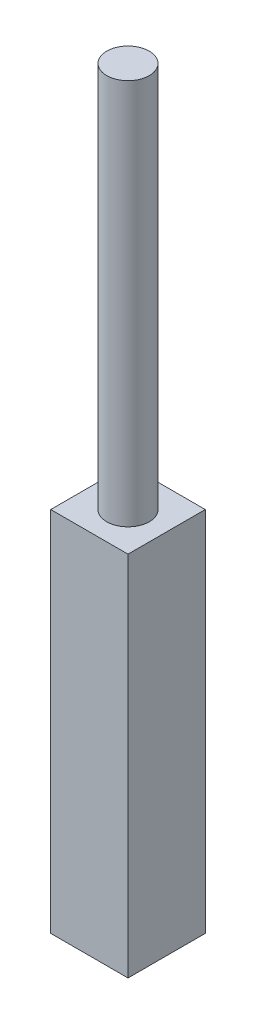
ISO-10303-21;
HEADER;
FILE_DESCRIPTION(('STEP AP214'),'2;1');
FILE_NAME('part.step','',(''),(''),'','','');
FILE_SCHEMA(('AUTOMOTIVE_DESIGN { 1 0 10303 214 1 1 1 1 }'));
ENDSEC;
DATA;
#1=APPLICATION_CONTEXT('core data for automotive mechanical design processes');
#2=APPLICATION_PROTOCOL_DEFINITION('international standard','automotive_design',2000,#1);
#3=PRODUCT_CONTEXT('',#1,'mechanical');
#4=PRODUCT('Part','Part','',(#3));
#5=PRODUCT_RELATED_PRODUCT_CATEGORY('part','',(#4));
#6=PRODUCT_DEFINITION_FORMATION('','',#4);
#7=PRODUCT_DEFINITION_CONTEXT('part definition',#1,'design');
#8=PRODUCT_DEFINITION('design','',#6,#7);
#9=PRODUCT_DEFINITION_SHAPE('','',#8);
#10=(LENGTH_UNIT() NAMED_UNIT(*) SI_UNIT(.MILLI.,.METRE.));
#11=(NAMED_UNIT(*) PLANE_ANGLE_UNIT() SI_UNIT($,.RADIAN.));
#12=(NAMED_UNIT(*) SI_UNIT($,.STERADIAN.) SOLID_ANGLE_UNIT());
#13=UNCERTAINTY_MEASURE_WITH_UNIT(LENGTH_MEASURE(1.E-05),#10,'distance_accuracy_value','');
#14=(GEOMETRIC_REPRESENTATION_CONTEXT(3) GLOBAL_UNCERTAINTY_ASSIGNED_CONTEXT((#13)) GLOBAL_UNIT_ASSIGNED_CONTEXT((#10,
#11,#12)) REPRESENTATION_CONTEXT('',''));
#15=CARTESIAN_POINT('',(0.,0.,0.));
#16=DIRECTION('',(0.,0.,1.));
#17=DIRECTION('',(1.,0.,0.));
#18=AXIS2_PLACEMENT_3D('',#15,#16,#17);
#19=CARTESIAN_POINT('',(1.27,12.065,1.27));
#20=DIRECTION('',(-1.,0.,0.));
#21=DIRECTION('',(0.,0.,1.));
#22=AXIS2_PLACEMENT_3D('',#19,#20,#21);
#23=PLANE('',#22);
#24=DIRECTION('',(0.,0.,-1.));
#25=VECTOR('',#24,1.);
#26=CARTESIAN_POINT('',(1.27,0.,1.27));
#27=LINE('',#26,#25);
#28=CARTESIAN_POINT('',(1.27,0.,1.27));
#29=VERTEX_POINT('',#28);
#30=CARTESIAN_POINT('',(1.27,0.,-1.27));
#31=VERTEX_POINT('',#30);
#32=EDGE_CURVE('E120',#29,#31,#27,.T.);
#33=ORIENTED_EDGE('',*,*,#32,.T.);
#34=DIRECTION('',(0.,-1.,0.));
#35=VECTOR('',#34,1.);
#36=CARTESIAN_POINT('',(1.27,12.065,-1.27));
#37=LINE('',#36,#35);
#38=CARTESIAN_POINT('',(1.27,12.065,-1.27));
#39=VERTEX_POINT('',#38);
#40=EDGE_CURVE('E52',#39,#31,#37,.T.);
#41=ORIENTED_EDGE('',*,*,#40,.F.);
#42=DIRECTION('',(0.,0.,-1.));
#43=VECTOR('',#42,1.);
#44=CARTESIAN_POINT('',(1.27,12.065,1.27));
#45=LINE('',#44,#43);
#46=CARTESIAN_POINT('',(1.27,12.065,1.27));
#47=VERTEX_POINT('',#46);
#48=EDGE_CURVE('E103',#47,#39,#45,.T.);
#49=ORIENTED_EDGE('',*,*,#48,.F.);
#50=DIRECTION('',(0.,-1.,0.));
#51=VECTOR('',#50,1.);
#52=CARTESIAN_POINT('',(1.27,12.065,1.27));
#53=LINE('',#52,#51);
#54=EDGE_CURVE('E116',#47,#29,#53,.T.);
#55=ORIENTED_EDGE('',*,*,#54,.T.);
#56=EDGE_LOOP('',(#33,#41,#49,#55));
#57=FACE_BOUND('',#56,.T.);
#58=ADVANCED_FACE('F49',(#57),#23,.F.);
#59=CARTESIAN_POINT('',(-1.27,12.065,-1.27));
#60=DIRECTION('',(0.,0.,1.));
#61=DIRECTION('',(1.,0.,0.));
#62=AXIS2_PLACEMENT_3D('',#59,#60,#61);
#63=PLANE('',#62);
#64=DIRECTION('',(-1.,0.,0.));
#65=VECTOR('',#64,1.);
#66=CARTESIAN_POINT('',(-1.27,0.,-1.27));
#67=LINE('',#66,#65);
#68=CARTESIAN_POINT('',(-1.27,0.,-1.27));
#69=VERTEX_POINT('',#68);
#70=EDGE_CURVE('E109',#31,#69,#67,.T.);
#71=ORIENTED_EDGE('',*,*,#70,.T.);
#72=DIRECTION('',(0.,-1.,0.));
#73=VECTOR('',#72,1.);
#74=CARTESIAN_POINT('',(-1.27,12.065,-1.27));
#75=LINE('',#74,#73);
#76=CARTESIAN_POINT('',(-1.27,12.065,-1.27));
#77=VERTEX_POINT('',#76);
#78=EDGE_CURVE('E107',#77,#69,#75,.T.);
#79=ORIENTED_EDGE('',*,*,#78,.F.);
#80=DIRECTION('',(-1.,0.,0.));
#81=VECTOR('',#80,1.);
#82=CARTESIAN_POINT('',(-1.27,12.065,-1.27));
#83=LINE('',#82,#81);
#84=EDGE_CURVE('E98',#39,#77,#83,.T.);
#85=ORIENTED_EDGE('',*,*,#84,.F.);
#86=ORIENTED_EDGE('',*,*,#40,.T.);
#87=EDGE_LOOP('',(#71,#79,#85,#86));
#88=FACE_BOUND('',#87,.T.);
#89=ADVANCED_FACE('F108',(#88),#63,.F.);
#90=CARTESIAN_POINT('',(-1.27,12.065,1.27));
#91=DIRECTION('',(1.,0.,0.));
#92=DIRECTION('',(0.,0.,-1.));
#93=AXIS2_PLACEMENT_3D('',#90,#91,#92);
#94=PLANE('',#93);
#95=DIRECTION('',(0.,0.,1.));
#96=VECTOR('',#95,1.);
#97=CARTESIAN_POINT('',(-1.27,0.,1.27));
#98=LINE('',#97,#96);
#99=CARTESIAN_POINT('',(-1.27,0.,1.27));
#100=VERTEX_POINT('',#99);
#101=EDGE_CURVE('E84',#69,#100,#98,.T.);
#102=ORIENTED_EDGE('',*,*,#101,.T.);
#103=DIRECTION('',(0.,-1.,0.));
#104=VECTOR('',#103,1.);
#105=CARTESIAN_POINT('',(-1.27,12.065,1.27));
#106=LINE('',#105,#104);
#107=CARTESIAN_POINT('',(-1.27,12.065,1.27));
#108=VERTEX_POINT('',#107);
#109=EDGE_CURVE('E111',#108,#100,#106,.T.);
#110=ORIENTED_EDGE('',*,*,#109,.F.);
#111=DIRECTION('',(0.,0.,1.));
#112=VECTOR('',#111,1.);
#113=CARTESIAN_POINT('',(-1.27,12.065,1.27));
#114=LINE('',#113,#112);
#115=EDGE_CURVE('E101',#77,#108,#114,.T.);
#116=ORIENTED_EDGE('',*,*,#115,.F.);
#117=ORIENTED_EDGE('',*,*,#78,.T.);
#118=EDGE_LOOP('',(#102,#110,#116,#117));
#119=FACE_BOUND('',#118,.T.);
#120=ADVANCED_FACE('F112',(#119),#94,.F.);
#121=CARTESIAN_POINT('',(-1.27,12.065,1.27));
#122=DIRECTION('',(0.,0.,-1.));
#123=DIRECTION('',(-1.,0.,0.));
#124=AXIS2_PLACEMENT_3D('',#121,#122,#123);
#125=PLANE('',#124);
#126=DIRECTION('',(1.,0.,0.));
#127=VECTOR('',#126,1.);
#128=CARTESIAN_POINT('',(-1.27,0.,1.27));
#129=LINE('',#128,#127);
#130=EDGE_CURVE('E90',#100,#29,#129,.T.);
#131=ORIENTED_EDGE('',*,*,#130,.T.);
#132=ORIENTED_EDGE('',*,*,#54,.F.);
#133=DIRECTION('',(1.,0.,0.));
#134=VECTOR('',#133,1.);
#135=CARTESIAN_POINT('',(-1.27,12.065,1.27));
#136=LINE('',#135,#134);
#137=EDGE_CURVE('E67',#108,#47,#136,.T.);
#138=ORIENTED_EDGE('',*,*,#137,.F.);
#139=ORIENTED_EDGE('',*,*,#109,.T.);
#140=EDGE_LOOP('',(#131,#132,#138,#139));
#141=FACE_BOUND('',#140,.T.);
#142=ADVANCED_FACE('F134',(#141),#125,.F.);
#143=CARTESIAN_POINT('',(0.,12.065,0.));
#144=DIRECTION('',(0.,-1.,0.));
#145=DIRECTION('',(0.,0.,-1.));
#146=AXIS2_PLACEMENT_3D('',#143,#144,#145);
#147=PLANE('',#146);
#148=CARTESIAN_POINT('',(0.,12.065,0.));
#149=DIRECTION('',(0.,1.,0.));
#150=DIRECTION('',(0.,0.,1.));
#151=AXIS2_PLACEMENT_3D('',#148,#149,#150);
#152=CIRCLE('',#151,0.6985);
#153=CARTESIAN_POINT('',(0.,12.065,0.6985));
#154=VERTEX_POINT('',#153);
#155=EDGE_CURVE('E11',#154,#154,#152,.T.);
#156=ORIENTED_EDGE('',*,*,#155,.F.);
#157=EDGE_LOOP('',(#156));
#158=FACE_BOUND('',#157,.T.);
#159=ORIENTED_EDGE('',*,*,#48,.T.);
#160=ORIENTED_EDGE('',*,*,#84,.T.);
#161=ORIENTED_EDGE('',*,*,#115,.T.);
#162=ORIENTED_EDGE('',*,*,#137,.T.);
#163=EDGE_LOOP('',(#159,#160,#161,#162));
#164=FACE_BOUND('',#163,.T.);
#165=ADVANCED_FACE('F99',(#158,#164),#147,.F.);
#166=CARTESIAN_POINT('',(0.,0.,0.));
#167=DIRECTION('',(0.,-1.,0.));
#168=DIRECTION('',(0.,0.,-1.));
#169=AXIS2_PLACEMENT_3D('',#166,#167,#168);
#170=PLANE('',#169);
#171=ORIENTED_EDGE('',*,*,#32,.F.);
#172=ORIENTED_EDGE('',*,*,#130,.F.);
#173=ORIENTED_EDGE('',*,*,#101,.F.);
#174=ORIENTED_EDGE('',*,*,#70,.F.);
#175=EDGE_LOOP('',(#171,#172,#173,#174));
#176=FACE_BOUND('',#175,.T.);
#177=ADVANCED_FACE('F137',(#176),#170,.T.);
#178=CARTESIAN_POINT('',(0.,24.765,0.));
#179=DIRECTION('',(0.,-1.,0.));
#180=DIRECTION('',(0.,0.,-1.));
#181=AXIS2_PLACEMENT_3D('',#178,#179,#180);
#182=CYLINDRICAL_SURFACE('',#181,0.6985);
#183=CARTESIAN_POINT('',(0.,24.765,0.));
#184=DIRECTION('',(0.,1.,0.));
#185=DIRECTION('',(0.,0.,1.));
#186=AXIS2_PLACEMENT_3D('',#183,#184,#185);
#187=CIRCLE('',#186,0.6985);
#188=CARTESIAN_POINT('',(0.,24.765,0.6985));
#189=VERTEX_POINT('',#188);
#190=EDGE_CURVE('E124',#189,#189,#187,.T.);
#191=ORIENTED_EDGE('',*,*,#190,.F.);
#192=EDGE_LOOP('',(#191));
#193=FACE_BOUND('',#192,.T.);
#194=ORIENTED_EDGE('',*,*,#155,.T.);
#195=EDGE_LOOP('',(#194));
#196=FACE_BOUND('',#195,.T.);
#197=ADVANCED_FACE('F147',(#193,#196),#182,.T.);
#198=CARTESIAN_POINT('',(0.,24.765,0.));
#199=DIRECTION('',(0.,1.,0.));
#200=DIRECTION('',(0.,0.,1.));
#201=AXIS2_PLACEMENT_3D('',#198,#199,#200);
#202=PLANE('',#201);
#203=ORIENTED_EDGE('',*,*,#190,.T.);
#204=EDGE_LOOP('',(#203));
#205=FACE_BOUND('',#204,.T.);
#206=ADVANCED_FACE('F145',(#205),#202,.T.);
#207=CLOSED_SHELL('',(#58,#89,#120,#142,#165,#177,#197,#206));
#208=MANIFOLD_SOLID_BREP('B2',#207);
#209=ADVANCED_BREP_SHAPE_REPRESENTATION('',(#18,#208),#14);
#210=SHAPE_DEFINITION_REPRESENTATION(#9,#209);
ENDSEC;
END-ISO-10303-21;
